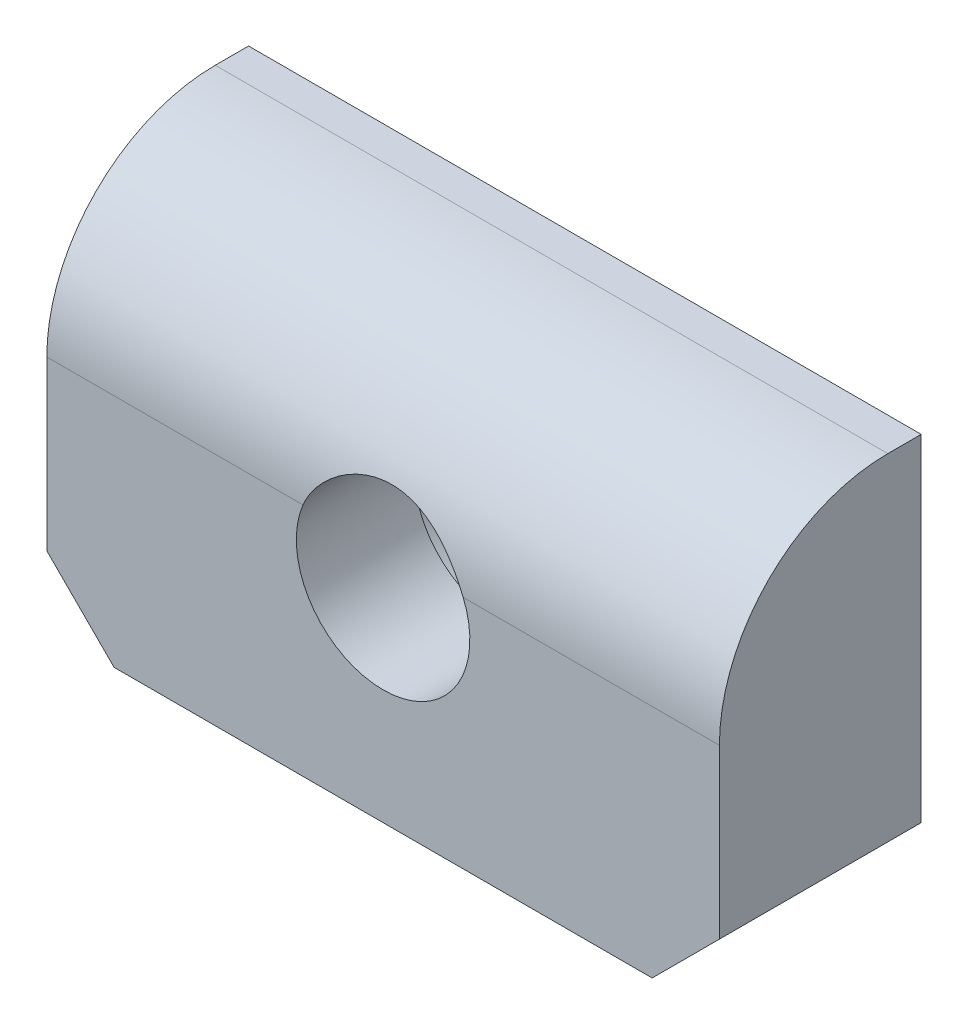
ISO-10303-21;
HEADER;
FILE_DESCRIPTION(('STEP AP214'),'2;1');
FILE_NAME('part.step','',(''),(''),'','','');
FILE_SCHEMA(('AUTOMOTIVE_DESIGN { 1 0 10303 214 1 1 1 1 }'));
ENDSEC;
DATA;
#1=APPLICATION_CONTEXT('core data for automotive mechanical design processes');
#2=APPLICATION_PROTOCOL_DEFINITION('international standard','automotive_design',2000,#1);
#3=PRODUCT_CONTEXT('',#1,'mechanical');
#4=PRODUCT('Part','Part','',(#3));
#5=PRODUCT_RELATED_PRODUCT_CATEGORY('part','',(#4));
#6=PRODUCT_DEFINITION_FORMATION('','',#4);
#7=PRODUCT_DEFINITION_CONTEXT('part definition',#1,'design');
#8=PRODUCT_DEFINITION('design','',#6,#7);
#9=PRODUCT_DEFINITION_SHAPE('','',#8);
#10=(LENGTH_UNIT() NAMED_UNIT(*) SI_UNIT(.MILLI.,.METRE.));
#11=(NAMED_UNIT(*) PLANE_ANGLE_UNIT() SI_UNIT($,.RADIAN.));
#12=(NAMED_UNIT(*) SI_UNIT($,.STERADIAN.) SOLID_ANGLE_UNIT());
#13=UNCERTAINTY_MEASURE_WITH_UNIT(LENGTH_MEASURE(1.E-05),#10,'distance_accuracy_value','');
#14=(GEOMETRIC_REPRESENTATION_CONTEXT(3) GLOBAL_UNCERTAINTY_ASSIGNED_CONTEXT((#13)) GLOBAL_UNIT_ASSIGNED_CONTEXT((#10,
#11,#12)) REPRESENTATION_CONTEXT('',''));
#15=CARTESIAN_POINT('',(0.,0.,0.));
#16=DIRECTION('',(0.,0.,1.));
#17=DIRECTION('',(1.,0.,0.));
#18=AXIS2_PLACEMENT_3D('',#15,#16,#17);
#19=CARTESIAN_POINT('',(15.875,1.5748,-3.1877));
#20=DIRECTION('',(-1.,0.,0.));
#21=DIRECTION('',(0.,0.,1.));
#22=AXIS2_PLACEMENT_3D('',#19,#20,#21);
#23=CYLINDRICAL_SURFACE('',#22,7.9502);
#24=CARTESIAN_POINT('',(3.78089579630277,1.5748,4.7625));
#25=CARTESIAN_POINT('',(3.73764511666428,1.67867906125526,4.76251349214419));
#26=CARTESIAN_POINT('',(3.69009588792557,1.78074021126323,4.76046438007835));
#27=CARTESIAN_POINT('',(3.58685888108347,1.98045661637207,4.75276896412734));
#28=CARTESIAN_POINT('',(3.5311752324499,2.07811407429849,4.74712448058956));
#29=CARTESIAN_POINT('',(3.41225928894849,2.26807844037282,4.73278650666979));
#30=CARTESIAN_POINT('',(3.34904979104688,2.3604003093659,4.72410207714591));
#31=CARTESIAN_POINT('',(3.21545446969633,2.53939112128411,4.70428070165083));
#32=CARTESIAN_POINT('',(3.14506786979089,2.62605945091306,4.69314349017333));
#33=CARTESIAN_POINT('',(2.92408979652606,2.87650712849038,4.65701820947085));
#34=CARTESIAN_POINT('',(2.76339880536697,3.03117652963659,4.62927740920085));
#35=CARTESIAN_POINT('',(2.4193186724157,3.31233290598027,4.57163996135627));
#36=CARTESIAN_POINT('',(2.23591180397985,3.43879765301582,4.54174163781931));
#37=CARTESIAN_POINT('',(1.84272569437724,3.66510738840005,4.48370951132597));
#38=CARTESIAN_POINT('',(1.63217384024424,3.76364951250464,4.45569818365644));
#39=CARTESIAN_POINT('',(1.19664015226295,3.92390430319093,4.40798627998287));
#40=CARTESIAN_POINT('',(0.971663992348502,3.98563135407442,4.38828245897178));
#41=CARTESIAN_POINT('',(0.518617809952876,4.06916582572976,4.3611897828952));
#42=CARTESIAN_POINT('',(0.290714943491398,4.09179313629622,4.35354829501983));
#43=CARTESIAN_POINT('',(-0.165715885323721,4.09875309046343,4.35122349756382));
#44=CARTESIAN_POINT('',(-0.394243718971896,4.08309310115072,4.35653769510232));
#45=CARTESIAN_POINT('',(-0.835847535534846,4.01552575989895,4.37865261270326));
#46=CARTESIAN_POINT('',(-1.04917600855499,3.96509255403067,4.39498562466589));
#47=CARTESIAN_POINT('',(-1.46439974192979,3.83122768091604,4.43588647594487));
#48=CARTESIAN_POINT('',(-1.66629165786572,3.74778641741649,4.46045670970685));
#49=CARTESIAN_POINT('',(-2.05990042575714,3.54715797240534,4.51467581661875));
#50=CARTESIAN_POINT('',(-2.25109936522538,3.42899423969652,4.54445983443189));
#51=CARTESIAN_POINT('',(-2.61173899323357,3.16293077284002,4.60344904916063));
#52=CARTESIAN_POINT('',(-2.78118326066897,3.01503594010057,4.63265434061318));
#53=CARTESIAN_POINT('',(-3.02649899629259,2.76257415643471,4.67382016585291));
#54=CARTESIAN_POINT('',(-3.111235878409,2.66678725667853,4.68778974964511));
#55=CARTESIAN_POINT('',(-3.27157060430174,2.46745598404892,4.71286525067097));
#56=CARTESIAN_POINT('',(-3.34716864467865,2.36391177813322,4.72397122951414));
#57=CARTESIAN_POINT('',(-3.48874694506618,2.14950494014029,4.74243182687905));
#58=CARTESIAN_POINT('',(-3.55468630633802,2.03861391990215,4.74977080493683));
#59=CARTESIAN_POINT('',(-3.67594386499142,1.81088730145999,4.75981766166352));
#60=CARTESIAN_POINT('',(-3.7312553891871,1.6940480262208,4.76252263903971));
#61=CARTESIAN_POINT('',(-3.78089579630277,1.5748,4.7625));
#62=B_SPLINE_CURVE_WITH_KNOTS('',3,(#24,#25,#26,#27,#28,#29,#30,#31,#32,#33,#34,#35,#36,#37,#38,
#39,#40,#41,#42,#43,#44,#45,#46,#47,#48,#49,#50,#51,#52,#53,#54,#55,#56,#57,#58,#59,#60,#61),
.UNSPECIFIED.,.F.,.F.,(4,2,2,2,2,2,2,2,2,2,2,2,2,2,2,2,2,2,4),(0.,0.337415874113215,
0.674661049197432,1.01090947276205,1.34719431211726,2.01819396036547,2.68972057104794,
3.38875919989834,4.08752452273054,4.77145098815131,5.4552458655802,6.11170361614915,
6.76835235553675,7.4456014180913,8.12273892217916,8.50818087404893,8.8936145325707,
9.28063581088512,9.66789931018303),.UNSPECIFIED.);
#63=CARTESIAN_POINT('',(3.78089579630277,1.5748,4.7625));
#64=VERTEX_POINT('',#63);
#65=CARTESIAN_POINT('',(-3.78089579630277,1.5748,4.7625));
#66=VERTEX_POINT('',#65);
#67=EDGE_CURVE('E60',#64,#66,#62,.T.);
#68=ORIENTED_EDGE('',*,*,#67,.F.);
#69=DIRECTION('',(-1.,0.,0.));
#70=VECTOR('',#69,1.);
#71=CARTESIAN_POINT('',(15.875,1.5748,4.7625));
#72=LINE('',#71,#70);
#73=CARTESIAN_POINT('',(15.875,1.5748,4.7625));
#74=VERTEX_POINT('',#73);
#75=EDGE_CURVE('E113',#74,#64,#72,.T.);
#76=ORIENTED_EDGE('',*,*,#75,.F.);
#77=CARTESIAN_POINT('',(15.875,1.5748,-3.1877));
#78=DIRECTION('',(1.,0.,0.));
#79=DIRECTION('',(0.,0.,-1.));
#80=AXIS2_PLACEMENT_3D('',#77,#78,#79);
#81=CIRCLE('',#80,7.9502);
#82=CARTESIAN_POINT('',(15.875,9.525,-3.1877));
#83=VERTEX_POINT('',#82);
#84=EDGE_CURVE('E161',#83,#74,#81,.T.);
#85=ORIENTED_EDGE('',*,*,#84,.F.);
#86=DIRECTION('',(-1.,0.,0.));
#87=VECTOR('',#86,1.);
#88=CARTESIAN_POINT('',(15.875,9.525,-3.1877));
#89=LINE('',#88,#87);
#90=CARTESIAN_POINT('',(-15.875,9.525,-3.1877));
#91=VERTEX_POINT('',#90);
#92=EDGE_CURVE('E122',#83,#91,#89,.T.);
#93=ORIENTED_EDGE('',*,*,#92,.T.);
#94=CARTESIAN_POINT('',(-15.875,1.5748,-3.1877));
#95=DIRECTION('',(1.,0.,0.));
#96=DIRECTION('',(0.,0.,-1.));
#97=AXIS2_PLACEMENT_3D('',#94,#95,#96);
#98=CIRCLE('',#97,7.9502);
#99=CARTESIAN_POINT('',(-15.875,1.5748,4.7625));
#100=VERTEX_POINT('',#99);
#101=EDGE_CURVE('E168',#91,#100,#98,.T.);
#102=ORIENTED_EDGE('',*,*,#101,.T.);
#103=EDGE_CURVE('E114',#66,#100,#72,.T.);
#104=ORIENTED_EDGE('',*,*,#103,.F.);
#105=EDGE_LOOP('',(#68,#76,#85,#93,#102,#104));
#106=FACE_BOUND('',#105,.T.);
#107=ADVANCED_FACE('F43',(#106),#23,.T.);
#108=CARTESIAN_POINT('',(15.875,-9.525,4.7625));
#109=DIRECTION('',(0.,1.,0.));
#110=DIRECTION('',(0.,0.,1.));
#111=AXIS2_PLACEMENT_3D('',#108,#109,#110);
#112=PLANE('',#111);
#113=DIRECTION('',(-1.,0.,0.));
#114=VECTOR('',#113,1.);
#115=CARTESIAN_POINT('',(15.875,-9.525,4.7625));
#116=LINE('',#115,#114);
#117=CARTESIAN_POINT('',(12.7,-9.525,4.7625));
#118=VERTEX_POINT('',#117);
#119=CARTESIAN_POINT('',(-12.7,-9.525,4.7625));
#120=VERTEX_POINT('',#119);
#121=EDGE_CURVE('E126',#118,#120,#116,.T.);
#122=ORIENTED_EDGE('',*,*,#121,.T.);
#123=DIRECTION('',(0.,0.,-1.));
#124=VECTOR('',#123,1.);
#125=CARTESIAN_POINT('',(-12.7,-9.525,4.7625));
#126=LINE('',#125,#124);
#127=CARTESIAN_POINT('',(-12.7,-9.525,-4.7625));
#128=VERTEX_POINT('',#127);
#129=EDGE_CURVE('E140',#120,#128,#126,.T.);
#130=ORIENTED_EDGE('',*,*,#129,.T.);
#131=DIRECTION('',(-1.,0.,0.));
#132=VECTOR('',#131,1.);
#133=CARTESIAN_POINT('',(15.875,-9.525,-4.7625));
#134=LINE('',#133,#132);
#135=CARTESIAN_POINT('',(12.7,-9.525,-4.7625));
#136=VERTEX_POINT('',#135);
#137=EDGE_CURVE('E135',#136,#128,#134,.T.);
#138=ORIENTED_EDGE('',*,*,#137,.F.);
#139=DIRECTION('',(0.,0.,1.));
#140=VECTOR('',#139,1.);
#141=CARTESIAN_POINT('',(12.7,-9.525,4.7625));
#142=LINE('',#141,#140);
#143=EDGE_CURVE('E133',#136,#118,#142,.T.);
#144=ORIENTED_EDGE('',*,*,#143,.T.);
#145=EDGE_LOOP('',(#122,#130,#138,#144));
#146=FACE_BOUND('',#145,.T.);
#147=ADVANCED_FACE('F193',(#146),#112,.F.);
#148=CARTESIAN_POINT('',(15.875,9.525,-4.7625));
#149=DIRECTION('',(0.,0.,1.));
#150=DIRECTION('',(1.,0.,0.));
#151=AXIS2_PLACEMENT_3D('',#148,#149,#150);
#152=PLANE('',#151);
#153=CARTESIAN_POINT('',(0.,0.,-4.7625));
#154=DIRECTION('',(0.,0.,1.));
#155=DIRECTION('',(0.,-1.,0.));
#156=AXIS2_PLACEMENT_3D('',#153,#154,#155);
#157=CIRCLE('',#156,5.6769);
#158=CARTESIAN_POINT('',(0.,-5.6769,-4.7625));
#159=VERTEX_POINT('',#158);
#160=EDGE_CURVE('E240',#159,#159,#157,.T.);
#161=ORIENTED_EDGE('',*,*,#160,.T.);
#162=EDGE_LOOP('',(#161));
#163=FACE_BOUND('',#162,.T.);
#164=ORIENTED_EDGE('',*,*,#137,.T.);
#165=DIRECTION('',(0.707106781186546,-0.707106781186549,0.));
#166=VECTOR('',#165,1.);
#167=CARTESIAN_POINT('',(-12.7,-9.525,-4.7625));
#168=LINE('',#167,#166);
#169=CARTESIAN_POINT('',(-15.875,-6.34999999999999,-4.7625));
#170=VERTEX_POINT('',#169);
#171=EDGE_CURVE('E145',#128,#170,#168,.F.);
#172=ORIENTED_EDGE('',*,*,#171,.T.);
#173=DIRECTION('',(0.,1.,0.));
#174=VECTOR('',#173,1.);
#175=CARTESIAN_POINT('',(-15.875,9.525,-4.7625));
#176=LINE('',#175,#174);
#177=CARTESIAN_POINT('',(-15.875,9.525,-4.7625));
#178=VERTEX_POINT('',#177);
#179=EDGE_CURVE('E116',#170,#178,#176,.T.);
#180=ORIENTED_EDGE('',*,*,#179,.T.);
#181=DIRECTION('',(-1.,0.,0.));
#182=VECTOR('',#181,1.);
#183=CARTESIAN_POINT('',(15.875,9.525,-4.7625));
#184=LINE('',#183,#182);
#185=CARTESIAN_POINT('',(15.875,9.525,-4.7625));
#186=VERTEX_POINT('',#185);
#187=EDGE_CURVE('E121',#186,#178,#184,.T.);
#188=ORIENTED_EDGE('',*,*,#187,.F.);
#189=DIRECTION('',(0.,1.,0.));
#190=VECTOR('',#189,1.);
#191=CARTESIAN_POINT('',(15.875,9.525,-4.7625));
#192=LINE('',#191,#190);
#193=CARTESIAN_POINT('',(15.875,-6.35,-4.7625));
#194=VERTEX_POINT('',#193);
#195=EDGE_CURVE('E154',#194,#186,#192,.T.);
#196=ORIENTED_EDGE('',*,*,#195,.F.);
#197=DIRECTION('',(-0.707106781186548,-0.707106781186547,0.));
#198=VECTOR('',#197,1.);
#199=CARTESIAN_POINT('',(15.875,-6.35,-4.7625));
#200=LINE('',#199,#198);
#201=EDGE_CURVE('E137',#194,#136,#200,.T.);
#202=ORIENTED_EDGE('',*,*,#201,.T.);
#203=EDGE_LOOP('',(#164,#172,#180,#188,#196,#202));
#204=FACE_BOUND('',#203,.T.);
#205=ADVANCED_FACE('F160',(#163,#204),#152,.F.);
#206=CARTESIAN_POINT('',(15.875,9.525,-4.7625));
#207=DIRECTION('',(0.,-1.,0.));
#208=DIRECTION('',(0.,0.,-1.));
#209=AXIS2_PLACEMENT_3D('',#206,#207,#208);
#210=PLANE('',#209);
#211=DIRECTION('',(0.,0.,1.));
#212=VECTOR('',#211,1.);
#213=CARTESIAN_POINT('',(-15.875,9.525,-4.7625));
#214=LINE('',#213,#212);
#215=EDGE_CURVE('E178',#178,#91,#214,.T.);
#216=ORIENTED_EDGE('',*,*,#215,.T.);
#217=ORIENTED_EDGE('',*,*,#92,.F.);
#218=DIRECTION('',(0.,0.,1.));
#219=VECTOR('',#218,1.);
#220=CARTESIAN_POINT('',(15.875,9.525,-4.7625));
#221=LINE('',#220,#219);
#222=EDGE_CURVE('E157',#186,#83,#221,.T.);
#223=ORIENTED_EDGE('',*,*,#222,.F.);
#224=ORIENTED_EDGE('',*,*,#187,.T.);
#225=EDGE_LOOP('',(#216,#217,#223,#224));
#226=FACE_BOUND('',#225,.T.);
#227=ADVANCED_FACE('F200',(#226),#210,.F.);
#228=CARTESIAN_POINT('',(15.875,1.5748,4.7625));
#229=DIRECTION('',(0.,0.,-1.));
#230=DIRECTION('',(0.,1.,0.));
#231=AXIS2_PLACEMENT_3D('',#228,#229,#230);
#232=PLANE('',#231);
#233=CARTESIAN_POINT('',(0.,0.,4.7625));
#234=DIRECTION('',(0.,0.,-1.));
#235=DIRECTION('',(0.,1.,0.));
#236=AXIS2_PLACEMENT_3D('',#233,#234,#235);
#237=CIRCLE('',#236,4.09575);
#238=EDGE_CURVE('E11',#66,#64,#237,.F.);
#239=ORIENTED_EDGE('',*,*,#238,.F.);
#240=ORIENTED_EDGE('',*,*,#103,.T.);
#241=DIRECTION('',(0.,-1.,0.));
#242=VECTOR('',#241,1.);
#243=CARTESIAN_POINT('',(-15.875,1.5748,4.7625));
#244=LINE('',#243,#242);
#245=CARTESIAN_POINT('',(-15.875,-6.34999999999999,4.7625));
#246=VERTEX_POINT('',#245);
#247=EDGE_CURVE('E163',#100,#246,#244,.T.);
#248=ORIENTED_EDGE('',*,*,#247,.T.);
#249=DIRECTION('',(-0.707106781186546,0.707106781186549,0.));
#250=VECTOR('',#249,1.);
#251=CARTESIAN_POINT('',(-12.7,-9.525,4.7625));
#252=LINE('',#251,#250);
#253=EDGE_CURVE('E150',#246,#120,#252,.F.);
#254=ORIENTED_EDGE('',*,*,#253,.T.);
#255=ORIENTED_EDGE('',*,*,#121,.F.);
#256=DIRECTION('',(0.707106781186548,0.707106781186547,0.));
#257=VECTOR('',#256,1.);
#258=CARTESIAN_POINT('',(15.875,-6.35,4.7625));
#259=LINE('',#258,#257);
#260=CARTESIAN_POINT('',(15.875,-6.35,4.7625));
#261=VERTEX_POINT('',#260);
#262=EDGE_CURVE('E64',#118,#261,#259,.T.);
#263=ORIENTED_EDGE('',*,*,#262,.T.);
#264=DIRECTION('',(0.,-1.,0.));
#265=VECTOR('',#264,1.);
#266=CARTESIAN_POINT('',(15.875,1.5748,4.7625));
#267=LINE('',#266,#265);
#268=EDGE_CURVE('E119',#74,#261,#267,.T.);
#269=ORIENTED_EDGE('',*,*,#268,.F.);
#270=ORIENTED_EDGE('',*,*,#75,.T.);
#271=EDGE_LOOP('',(#239,#240,#248,#254,#255,#263,#269,#270));
#272=FACE_BOUND('',#271,.T.);
#273=ADVANCED_FACE('F118',(#272),#232,.F.);
#274=CARTESIAN_POINT('',(15.875,1.5748,-3.1877));
#275=DIRECTION('',(1.,0.,0.));
#276=DIRECTION('',(0.,0.,-1.));
#277=AXIS2_PLACEMENT_3D('',#274,#275,#276);
#278=PLANE('',#277);
#279=ORIENTED_EDGE('',*,*,#268,.T.);
#280=DIRECTION('',(0.,0.,-1.));
#281=VECTOR('',#280,1.);
#282=CARTESIAN_POINT('',(15.875,-6.35,-4.7625));
#283=LINE('',#282,#281);
#284=EDGE_CURVE('E55',#261,#194,#283,.T.);
#285=ORIENTED_EDGE('',*,*,#284,.T.);
#286=ORIENTED_EDGE('',*,*,#195,.T.);
#287=ORIENTED_EDGE('',*,*,#222,.T.);
#288=ORIENTED_EDGE('',*,*,#84,.T.);
#289=EDGE_LOOP('',(#279,#285,#286,#287,#288));
#290=FACE_BOUND('',#289,.T.);
#291=ADVANCED_FACE('F155',(#290),#278,.T.);
#292=CARTESIAN_POINT('',(-15.875,1.5748,-3.1877));
#293=DIRECTION('',(1.,0.,0.));
#294=DIRECTION('',(0.,0.,-1.));
#295=AXIS2_PLACEMENT_3D('',#292,#293,#294);
#296=PLANE('',#295);
#297=ORIENTED_EDGE('',*,*,#179,.F.);
#298=DIRECTION('',(0.,0.,1.));
#299=VECTOR('',#298,1.);
#300=CARTESIAN_POINT('',(-15.875,-6.34999999999999,-3.1877));
#301=LINE('',#300,#299);
#302=EDGE_CURVE('E144',#170,#246,#301,.T.);
#303=ORIENTED_EDGE('',*,*,#302,.T.);
#304=ORIENTED_EDGE('',*,*,#247,.F.);
#305=ORIENTED_EDGE('',*,*,#101,.F.);
#306=ORIENTED_EDGE('',*,*,#215,.F.);
#307=EDGE_LOOP('',(#297,#303,#304,#305,#306));
#308=FACE_BOUND('',#307,.T.);
#309=ADVANCED_FACE('F187',(#308),#296,.F.);
#310=CARTESIAN_POINT('',(-12.7,-9.525,4.7625));
#311=DIRECTION('',(0.707106781186549,0.707106781186546,0.));
#312=DIRECTION('',(0.,0.,-1.));
#313=AXIS2_PLACEMENT_3D('',#310,#311,#312);
#314=PLANE('',#313);
#315=ORIENTED_EDGE('',*,*,#253,.F.);
#316=ORIENTED_EDGE('',*,*,#302,.F.);
#317=ORIENTED_EDGE('',*,*,#171,.F.);
#318=ORIENTED_EDGE('',*,*,#129,.F.);
#319=EDGE_LOOP('',(#315,#316,#317,#318));
#320=FACE_BOUND('',#319,.T.);
#321=ADVANCED_FACE('F195',(#320),#314,.F.);
#322=CARTESIAN_POINT('',(15.875,-6.35,-3.1877));
#323=DIRECTION('',(0.707106781186547,-0.707106781186548,0.));
#324=DIRECTION('',(0.,0.,1.));
#325=AXIS2_PLACEMENT_3D('',#322,#323,#324);
#326=PLANE('',#325);
#327=ORIENTED_EDGE('',*,*,#262,.F.);
#328=ORIENTED_EDGE('',*,*,#143,.F.);
#329=ORIENTED_EDGE('',*,*,#201,.F.);
#330=ORIENTED_EDGE('',*,*,#284,.F.);
#331=EDGE_LOOP('',(#327,#328,#329,#330));
#332=FACE_BOUND('',#331,.T.);
#333=ADVANCED_FACE('F46',(#332),#326,.T.);
#334=CARTESIAN_POINT('',(0.,0.,4.7625));
#335=DIRECTION('',(0.,0.,1.));
#336=DIRECTION('',(0.,-1.,0.));
#337=AXIS2_PLACEMENT_3D('',#334,#335,#336);
#338=CYLINDRICAL_SURFACE('',#337,4.09575);
#339=CARTESIAN_POINT('',(0.,0.,-0.800100000000001));
#340=DIRECTION('',(0.,0.,1.));
#341=DIRECTION('',(0.,-1.,0.));
#342=AXIS2_PLACEMENT_3D('',#339,#340,#341);
#343=CIRCLE('',#342,4.09575);
#344=CARTESIAN_POINT('',(0.,-4.09575000000001,-0.800100000000002));
#345=VERTEX_POINT('',#344);
#346=EDGE_CURVE('E120',#345,#345,#343,.T.);
#347=ORIENTED_EDGE('',*,*,#346,.F.);
#348=EDGE_LOOP('',(#347));
#349=FACE_BOUND('',#348,.T.);
#350=ORIENTED_EDGE('',*,*,#67,.T.);
#351=ORIENTED_EDGE('',*,*,#238,.T.);
#352=EDGE_LOOP('',(#350,#351));
#353=FACE_BOUND('',#352,.T.);
#354=ADVANCED_FACE('F110',(#349,#353),#338,.F.);
#355=CARTESIAN_POINT('',(0.,4.09575,-0.800099999999999));
#356=DIRECTION('',(0.,0.,-1.));
#357=DIRECTION('',(0.,1.,0.));
#358=AXIS2_PLACEMENT_3D('',#355,#356,#357);
#359=PLANE('',#358);
#360=ORIENTED_EDGE('',*,*,#346,.T.);
#361=EDGE_LOOP('',(#360));
#362=FACE_BOUND('',#361,.T.);
#363=CARTESIAN_POINT('',(0.,0.,-0.8001));
#364=DIRECTION('',(0.,0.,1.));
#365=DIRECTION('',(0.,-1.,0.));
#366=AXIS2_PLACEMENT_3D('',#363,#364,#365);
#367=CIRCLE('',#366,5.6769);
#368=CARTESIAN_POINT('',(0.,-5.6769,-0.800100000000002));
#369=VERTEX_POINT('',#368);
#370=EDGE_CURVE('E234',#369,#369,#367,.T.);
#371=ORIENTED_EDGE('',*,*,#370,.F.);
#372=EDGE_LOOP('',(#371));
#373=FACE_BOUND('',#372,.T.);
#374=ADVANCED_FACE('F223',(#362,#373),#359,.T.);
#375=CARTESIAN_POINT('',(0.,0.,4.7625));
#376=DIRECTION('',(0.,0.,1.));
#377=DIRECTION('',(0.,-1.,0.));
#378=AXIS2_PLACEMENT_3D('',#375,#376,#377);
#379=CYLINDRICAL_SURFACE('',#378,5.6769);
#380=ORIENTED_EDGE('',*,*,#370,.T.);
#381=EDGE_LOOP('',(#380));
#382=FACE_BOUND('',#381,.T.);
#383=ORIENTED_EDGE('',*,*,#160,.F.);
#384=EDGE_LOOP('',(#383));
#385=FACE_BOUND('',#384,.T.);
#386=ADVANCED_FACE('F222',(#382,#385),#379,.F.);
#387=CLOSED_SHELL('',(#107,#147,#205,#227,#273,#291,#309,#321,#333,#354,#374,#386));
#388=MANIFOLD_SOLID_BREP('B2',#387);
#389=ADVANCED_BREP_SHAPE_REPRESENTATION('',(#18,#388),#14);
#390=SHAPE_DEFINITION_REPRESENTATION(#9,#389);
ENDSEC;
END-ISO-10303-21;
